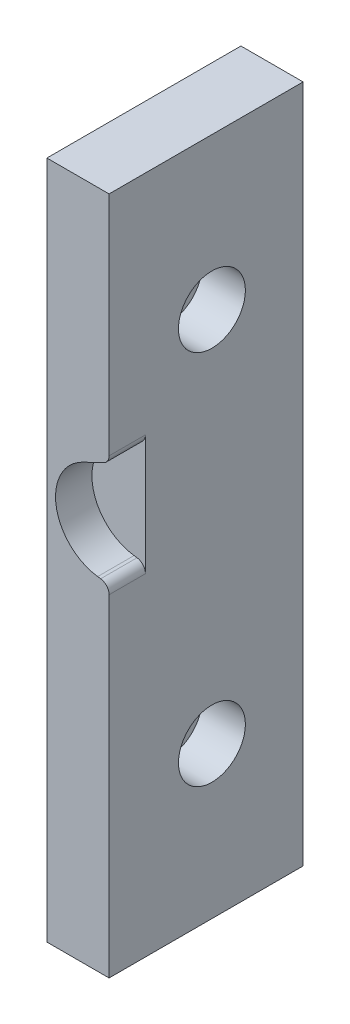
ISO-10303-21;
HEADER;
FILE_DESCRIPTION(('STEP AP214'),'2;1');
FILE_NAME('part.step','',(''),(''),'','','');
FILE_SCHEMA(('AUTOMOTIVE_DESIGN { 1 0 10303 214 1 1 1 1 }'));
ENDSEC;
DATA;
#1=APPLICATION_CONTEXT('core data for automotive mechanical design processes');
#2=APPLICATION_PROTOCOL_DEFINITION('international standard','automotive_design',2000,#1);
#3=PRODUCT_CONTEXT('',#1,'mechanical');
#4=PRODUCT('Part','Part','',(#3));
#5=PRODUCT_RELATED_PRODUCT_CATEGORY('part','',(#4));
#6=PRODUCT_DEFINITION_FORMATION('','',#4);
#7=PRODUCT_DEFINITION_CONTEXT('part definition',#1,'design');
#8=PRODUCT_DEFINITION('design','',#6,#7);
#9=PRODUCT_DEFINITION_SHAPE('','',#8);
#10=(LENGTH_UNIT() NAMED_UNIT(*) SI_UNIT(.MILLI.,.METRE.));
#11=(NAMED_UNIT(*) PLANE_ANGLE_UNIT() SI_UNIT($,.RADIAN.));
#12=(NAMED_UNIT(*) SI_UNIT($,.STERADIAN.) SOLID_ANGLE_UNIT());
#13=UNCERTAINTY_MEASURE_WITH_UNIT(LENGTH_MEASURE(1.E-05),#10,'distance_accuracy_value','');
#14=(GEOMETRIC_REPRESENTATION_CONTEXT(3) GLOBAL_UNCERTAINTY_ASSIGNED_CONTEXT((#13)) GLOBAL_UNIT_ASSIGNED_CONTEXT((#10,
#11,#12)) REPRESENTATION_CONTEXT('',''));
#15=CARTESIAN_POINT('',(0.,0.,0.));
#16=DIRECTION('',(0.,0.,1.));
#17=DIRECTION('',(1.,0.,0.));
#18=AXIS2_PLACEMENT_3D('',#15,#16,#17);
#19=CARTESIAN_POINT('',(-8.1407,-49.211738,-1.524));
#20=DIRECTION('',(1.,0.,0.));
#21=DIRECTION('',(0.,0.,-1.));
#22=AXIS2_PLACEMENT_3D('',#19,#20,#21);
#23=CYLINDRICAL_SURFACE('',#22,6.75767);
#24=CARTESIAN_POINT('',(-8.1407,-49.211738,-1.524));
#25=DIRECTION('',(1.,0.,0.));
#26=DIRECTION('',(0.,0.,-1.));
#27=AXIS2_PLACEMENT_3D('',#24,#25,#26);
#28=CIRCLE('',#27,6.75767);
#29=CARTESIAN_POINT('',(-8.1407,-49.211738,-8.28167));
#30=VERTEX_POINT('',#29);
#31=EDGE_CURVE('E227',#30,#30,#28,.T.);
#32=ORIENTED_EDGE('',*,*,#31,.F.);
#33=EDGE_LOOP('',(#32));
#34=FACE_BOUND('',#33,.T.);
#35=CARTESIAN_POINT('',(-3.1877,-49.211738,-1.524));
#36=DIRECTION('',(1.,0.,0.));
#37=DIRECTION('',(0.,0.,-1.));
#38=AXIS2_PLACEMENT_3D('',#35,#36,#37);
#39=CIRCLE('',#38,6.75767);
#40=CARTESIAN_POINT('',(-3.1877,-49.211738,-8.28167));
#41=VERTEX_POINT('',#40);
#42=EDGE_CURVE('E265',#41,#41,#39,.F.);
#43=ORIENTED_EDGE('',*,*,#42,.F.);
#44=EDGE_LOOP('',(#43));
#45=FACE_BOUND('',#44,.T.);
#46=ADVANCED_FACE('F45',(#34,#45),#23,.F.);
#47=CARTESIAN_POINT('',(-8.1407,49.211738,-1.524));
#48=DIRECTION('',(1.,0.,0.));
#49=DIRECTION('',(0.,0.,-1.));
#50=AXIS2_PLACEMENT_3D('',#47,#48,#49);
#51=CYLINDRICAL_SURFACE('',#50,6.75767);
#52=CARTESIAN_POINT('',(-8.1407,49.211738,-1.524));
#53=DIRECTION('',(1.,0.,0.));
#54=DIRECTION('',(0.,0.,-1.));
#55=AXIS2_PLACEMENT_3D('',#52,#53,#54);
#56=CIRCLE('',#55,6.75767);
#57=CARTESIAN_POINT('',(-8.1407,49.211738,-8.28167));
#58=VERTEX_POINT('',#57);
#59=EDGE_CURVE('E240',#58,#58,#56,.T.);
#60=ORIENTED_EDGE('',*,*,#59,.F.);
#61=EDGE_LOOP('',(#60));
#62=FACE_BOUND('',#61,.T.);
#63=CARTESIAN_POINT('',(-3.1877,49.211738,-1.524));
#64=DIRECTION('',(1.,0.,0.));
#65=DIRECTION('',(0.,0.,-1.));
#66=AXIS2_PLACEMENT_3D('',#63,#64,#65);
#67=CIRCLE('',#66,6.75767);
#68=CARTESIAN_POINT('',(-3.1877,49.211738,-8.28167));
#69=VERTEX_POINT('',#68);
#70=EDGE_CURVE('E262',#69,#69,#67,.F.);
#71=ORIENTED_EDGE('',*,*,#70,.F.);
#72=EDGE_LOOP('',(#71));
#73=FACE_BOUND('',#72,.T.);
#74=ADVANCED_FACE('F336',(#62,#73),#51,.F.);
#75=CARTESIAN_POINT('',(8.1407,88.9,25.4));
#76=DIRECTION('',(-1.,0.,0.));
#77=DIRECTION('',(0.,0.,1.));
#78=AXIS2_PLACEMENT_3D('',#75,#76,#77);
#79=PLANE('',#78);
#80=DIRECTION('',(0.,1.,0.));
#81=VECTOR('',#80,1.);
#82=CARTESIAN_POINT('',(8.1407,27.901182182498,15.875));
#83=LINE('',#82,#81);
#84=CARTESIAN_POINT('',(8.1407,-1.98819563841487,15.875));
#85=VERTEX_POINT('',#84);
#86=CARTESIAN_POINT('',(8.1407,29.5088515839507,15.875));
#87=VERTEX_POINT('',#86);
#88=EDGE_CURVE('E140',#85,#87,#83,.T.);
#89=ORIENTED_EDGE('',*,*,#88,.F.);
#90=DIRECTION('',(0.,0.,1.));
#91=VECTOR('',#90,1.);
#92=CARTESIAN_POINT('',(8.1407,-1.98819563841487,25.4));
#93=LINE('',#92,#91);
#94=CARTESIAN_POINT('',(8.1407,-1.98819563841487,25.4));
#95=VERTEX_POINT('',#94);
#96=EDGE_CURVE('E181',#85,#95,#93,.T.);
#97=ORIENTED_EDGE('',*,*,#96,.T.);
#98=DIRECTION('',(0.,1.,0.));
#99=VECTOR('',#98,1.);
#100=CARTESIAN_POINT('',(8.1407,88.9,25.4));
#101=LINE('',#100,#99);
#102=CARTESIAN_POINT('',(8.1407,-88.9,25.4));
#103=VERTEX_POINT('',#102);
#104=EDGE_CURVE('E211',#103,#95,#101,.T.);
#105=ORIENTED_EDGE('',*,*,#104,.F.);
#106=DIRECTION('',(0.,0.,-1.));
#107=VECTOR('',#106,1.);
#108=CARTESIAN_POINT('',(8.1407,-88.9,25.4));
#109=LINE('',#108,#107);
#110=CARTESIAN_POINT('',(8.1407,-88.9,-25.4));
#111=VERTEX_POINT('',#110);
#112=EDGE_CURVE('E234',#103,#111,#109,.T.);
#113=ORIENTED_EDGE('',*,*,#112,.T.);
#114=DIRECTION('',(0.,1.,0.));
#115=VECTOR('',#114,1.);
#116=CARTESIAN_POINT('',(8.1407,88.9,-25.4));
#117=LINE('',#116,#115);
#118=CARTESIAN_POINT('',(8.1407,88.9,-25.4));
#119=VERTEX_POINT('',#118);
#120=EDGE_CURVE('E235',#111,#119,#117,.T.);
#121=ORIENTED_EDGE('',*,*,#120,.T.);
#122=DIRECTION('',(0.,0.,-1.));
#123=VECTOR('',#122,1.);
#124=CARTESIAN_POINT('',(8.1407,88.9,25.4));
#125=LINE('',#124,#123);
#126=CARTESIAN_POINT('',(8.1407,88.9,25.4));
#127=VERTEX_POINT('',#126);
#128=EDGE_CURVE('E258',#127,#119,#125,.T.);
#129=ORIENTED_EDGE('',*,*,#128,.F.);
#130=CARTESIAN_POINT('',(8.1407,29.5088515839507,25.4));
#131=VERTEX_POINT('',#130);
#132=EDGE_CURVE('E219',#131,#127,#101,.T.);
#133=ORIENTED_EDGE('',*,*,#132,.F.);
#134=DIRECTION('',(0.,0.,1.));
#135=VECTOR('',#134,1.);
#136=CARTESIAN_POINT('',(8.1407,29.5088515839507,25.4));
#137=LINE('',#136,#135);
#138=EDGE_CURVE('E188',#131,#87,#137,.F.);
#139=ORIENTED_EDGE('',*,*,#138,.T.);
#140=EDGE_LOOP('',(#89,#97,#105,#113,#121,#129,#133,#139));
#141=FACE_BOUND('',#140,.T.);
#142=CARTESIAN_POINT('',(8.1407,49.211738,-1.524));
#143=DIRECTION('',(1.,0.,0.));
#144=DIRECTION('',(0.,0.,-1.));
#145=AXIS2_PLACEMENT_3D('',#142,#143,#144);
#146=CIRCLE('',#145,8.7641176);
#147=CARTESIAN_POINT('',(8.1407,49.211738,-10.2881176));
#148=VERTEX_POINT('',#147);
#149=EDGE_CURVE('E284',#148,#148,#146,.T.);
#150=ORIENTED_EDGE('',*,*,#149,.F.);
#151=EDGE_LOOP('',(#150));
#152=FACE_BOUND('',#151,.T.);
#153=CARTESIAN_POINT('',(8.1407,-49.211738,-1.524));
#154=DIRECTION('',(1.,0.,0.));
#155=DIRECTION('',(0.,0.,-1.));
#156=AXIS2_PLACEMENT_3D('',#153,#154,#155);
#157=CIRCLE('',#156,8.7641176);
#158=CARTESIAN_POINT('',(8.1407,-49.211738,-10.2881176));
#159=VERTEX_POINT('',#158);
#160=EDGE_CURVE('E285',#159,#159,#157,.T.);
#161=ORIENTED_EDGE('',*,*,#160,.F.);
#162=EDGE_LOOP('',(#161));
#163=FACE_BOUND('',#162,.T.);
#164=ADVANCED_FACE('F208',(#141,#152,#163),#79,.F.);
#165=CARTESIAN_POINT('',(8.1407,88.9,25.4));
#166=DIRECTION('',(0.,-1.,0.));
#167=DIRECTION('',(1.,0.,0.));
#168=AXIS2_PLACEMENT_3D('',#165,#166,#167);
#169=PLANE('',#168);
#170=DIRECTION('',(-1.,0.,0.));
#171=VECTOR('',#170,1.);
#172=CARTESIAN_POINT('',(8.1407,88.9,-25.4));
#173=LINE('',#172,#171);
#174=CARTESIAN_POINT('',(-8.1407,88.9,-25.4));
#175=VERTEX_POINT('',#174);
#176=EDGE_CURVE('E239',#119,#175,#173,.T.);
#177=ORIENTED_EDGE('',*,*,#176,.T.);
#178=DIRECTION('',(0.,0.,-1.));
#179=VECTOR('',#178,1.);
#180=CARTESIAN_POINT('',(-8.1407,88.9,25.4));
#181=LINE('',#180,#179);
#182=CARTESIAN_POINT('',(-8.1407,88.9,25.4));
#183=VERTEX_POINT('',#182);
#184=EDGE_CURVE('E254',#183,#175,#181,.T.);
#185=ORIENTED_EDGE('',*,*,#184,.F.);
#186=DIRECTION('',(-1.,0.,0.));
#187=VECTOR('',#186,1.);
#188=CARTESIAN_POINT('',(8.1407,88.9,25.4));
#189=LINE('',#188,#187);
#190=EDGE_CURVE('E218',#127,#183,#189,.T.);
#191=ORIENTED_EDGE('',*,*,#190,.F.);
#192=ORIENTED_EDGE('',*,*,#128,.T.);
#193=EDGE_LOOP('',(#177,#185,#191,#192));
#194=FACE_BOUND('',#193,.T.);
#195=ADVANCED_FACE('F311',(#194),#169,.F.);
#196=CARTESIAN_POINT('',(-8.1407,88.9,25.4));
#197=DIRECTION('',(1.,0.,0.));
#198=DIRECTION('',(0.,0.,-1.));
#199=AXIS2_PLACEMENT_3D('',#196,#197,#198);
#200=PLANE('',#199);
#201=ORIENTED_EDGE('',*,*,#59,.T.);
#202=EDGE_LOOP('',(#201));
#203=FACE_BOUND('',#202,.T.);
#204=ORIENTED_EDGE('',*,*,#31,.T.);
#205=EDGE_LOOP('',(#204));
#206=FACE_BOUND('',#205,.T.);
#207=DIRECTION('',(0.,-1.,0.));
#208=VECTOR('',#207,1.);
#209=CARTESIAN_POINT('',(-8.1407,88.9,-25.4));
#210=LINE('',#209,#208);
#211=CARTESIAN_POINT('',(-8.1407,-88.9,-25.4));
#212=VERTEX_POINT('',#211);
#213=EDGE_CURVE('E243',#175,#212,#210,.T.);
#214=ORIENTED_EDGE('',*,*,#213,.T.);
#215=DIRECTION('',(0.,0.,-1.));
#216=VECTOR('',#215,1.);
#217=CARTESIAN_POINT('',(-8.1407,-88.9,25.4));
#218=LINE('',#217,#216);
#219=CARTESIAN_POINT('',(-8.1407,-88.9,25.4));
#220=VERTEX_POINT('',#219);
#221=EDGE_CURVE('E250',#220,#212,#218,.T.);
#222=ORIENTED_EDGE('',*,*,#221,.F.);
#223=DIRECTION('',(0.,-1.,0.));
#224=VECTOR('',#223,1.);
#225=CARTESIAN_POINT('',(-8.1407,88.9,25.4));
#226=LINE('',#225,#224);
#227=EDGE_CURVE('E223',#183,#220,#226,.T.);
#228=ORIENTED_EDGE('',*,*,#227,.F.);
#229=ORIENTED_EDGE('',*,*,#184,.T.);
#230=EDGE_LOOP('',(#214,#222,#228,#229));
#231=FACE_BOUND('',#230,.T.);
#232=ADVANCED_FACE('F316',(#203,#206,#231),#200,.F.);
#233=CARTESIAN_POINT('',(-8.1407,-88.9,25.4));
#234=DIRECTION('',(0.,1.,0.));
#235=DIRECTION('',(-1.,0.,0.));
#236=AXIS2_PLACEMENT_3D('',#233,#234,#235);
#237=PLANE('',#236);
#238=DIRECTION('',(1.,0.,0.));
#239=VECTOR('',#238,1.);
#240=CARTESIAN_POINT('',(-8.1407,-88.9,-25.4));
#241=LINE('',#240,#239);
#242=EDGE_CURVE('E225',#212,#111,#241,.T.);
#243=ORIENTED_EDGE('',*,*,#242,.T.);
#244=ORIENTED_EDGE('',*,*,#112,.F.);
#245=DIRECTION('',(1.,0.,0.));
#246=VECTOR('',#245,1.);
#247=CARTESIAN_POINT('',(-8.1407,-88.9,25.4));
#248=LINE('',#247,#246);
#249=EDGE_CURVE('E215',#220,#103,#248,.T.);
#250=ORIENTED_EDGE('',*,*,#249,.F.);
#251=ORIENTED_EDGE('',*,*,#221,.T.);
#252=EDGE_LOOP('',(#243,#244,#250,#251));
#253=FACE_BOUND('',#252,.T.);
#254=ADVANCED_FACE('F319',(#253),#237,.F.);
#255=CARTESIAN_POINT('',(0.,0.,25.4));
#256=DIRECTION('',(0.,0.,1.));
#257=DIRECTION('',(1.,0.,0.));
#258=AXIS2_PLACEMENT_3D('',#255,#256,#257);
#259=PLANE('',#258);
#260=ORIENTED_EDGE('',*,*,#104,.T.);
#261=CARTESIAN_POINT('',(5.6007,-1.98819563841487,25.4));
#262=DIRECTION('',(0.,0.,1.));
#263=DIRECTION('',(1.,0.,0.));
#264=AXIS2_PLACEMENT_3D('',#261,#262,#263);
#265=CIRCLE('',#264,2.54);
#266=CARTESIAN_POINT('',(5.93498114050861,0.52971145262327,25.4));
#267=VERTEX_POINT('',#266);
#268=EDGE_CURVE('E192',#95,#267,#265,.T.);
#269=ORIENTED_EDGE('',*,*,#268,.T.);
#270=DIRECTION('',(0.991302004345733,-0.131606748231737,0.));
#271=VECTOR('',#270,1.);
#272=CARTESIAN_POINT('',(5.14779874837508,0.63421897347949,25.4));
#273=LINE('',#272,#271);
#274=CARTESIAN_POINT('',(5.14779874837508,0.63421897347949,25.4));
#275=VERTEX_POINT('',#274);
#276=EDGE_CURVE('E148',#275,#267,#273,.T.);
#277=ORIENTED_EDGE('',*,*,#276,.F.);
#278=CARTESIAN_POINT('',(6.81920445095724,13.2237544286771,25.4));
#279=DIRECTION('',(0.,0.,1.));
#280=DIRECTION('',(1.,0.,0.));
#281=AXIS2_PLACEMENT_3D('',#278,#279,#280);
#282=CIRCLE('',#281,12.7000000000117);
#283=CARTESIAN_POINT('',(1.38429999999978,24.7020737137143,25.4));
#284=VERTEX_POINT('',#283);
#285=EDGE_CURVE('E129',#284,#275,#282,.T.);
#286=ORIENTED_EDGE('',*,*,#285,.F.);
#287=DIRECTION('',(-0.903804668113621,-0.427945232355761,0.));
#288=VECTOR('',#287,1.);
#289=CARTESIAN_POINT('',(1.38429999999978,24.7020737137143,25.4));
#290=LINE('',#289,#288);
#291=CARTESIAN_POINT('',(6.68768089018363,27.2131877269421,25.4));
#292=VERTEX_POINT('',#291);
#293=EDGE_CURVE('E145',#292,#284,#290,.T.);
#294=ORIENTED_EDGE('',*,*,#293,.F.);
#295=CARTESIAN_POINT('',(5.6007,29.5088515839507,25.4));
#296=DIRECTION('',(0.,0.,1.));
#297=DIRECTION('',(1.,0.,0.));
#298=AXIS2_PLACEMENT_3D('',#295,#296,#297);
#299=CIRCLE('',#298,2.54);
#300=EDGE_CURVE('E187',#292,#131,#299,.T.);
#301=ORIENTED_EDGE('',*,*,#300,.T.);
#302=ORIENTED_EDGE('',*,*,#132,.T.);
#303=ORIENTED_EDGE('',*,*,#190,.T.);
#304=ORIENTED_EDGE('',*,*,#227,.T.);
#305=ORIENTED_EDGE('',*,*,#249,.T.);
#306=EDGE_LOOP('',(#260,#269,#277,#286,#294,#301,#302,#303,#304,#305));
#307=FACE_BOUND('',#306,.T.);
#308=ADVANCED_FACE('F213',(#307),#259,.T.);
#309=CARTESIAN_POINT('',(0.,0.,-25.4));
#310=DIRECTION('',(0.,0.,1.));
#311=DIRECTION('',(1.,0.,0.));
#312=AXIS2_PLACEMENT_3D('',#309,#310,#311);
#313=PLANE('',#312);
#314=ORIENTED_EDGE('',*,*,#120,.F.);
#315=ORIENTED_EDGE('',*,*,#242,.F.);
#316=ORIENTED_EDGE('',*,*,#213,.F.);
#317=ORIENTED_EDGE('',*,*,#176,.F.);
#318=EDGE_LOOP('',(#314,#315,#316,#317));
#319=FACE_BOUND('',#318,.T.);
#320=ADVANCED_FACE('F322',(#319),#313,.F.);
#321=CARTESIAN_POINT('',(-3.1877,88.9,25.4));
#322=DIRECTION('',(1.,0.,0.));
#323=DIRECTION('',(0.,0.,-1.));
#324=AXIS2_PLACEMENT_3D('',#321,#322,#323);
#325=PLANE('',#324);
#326=CARTESIAN_POINT('',(-3.1877,49.211738,-1.524));
#327=DIRECTION('',(1.,0.,0.));
#328=DIRECTION('',(0.,0.,-1.));
#329=AXIS2_PLACEMENT_3D('',#326,#327,#328);
#330=CIRCLE('',#329,8.7641176);
#331=CARTESIAN_POINT('',(-3.1877,49.211738,-10.2881176));
#332=VERTEX_POINT('',#331);
#333=EDGE_CURVE('E266',#332,#332,#330,.F.);
#334=ORIENTED_EDGE('',*,*,#333,.F.);
#335=EDGE_LOOP('',(#334));
#336=FACE_BOUND('',#335,.T.);
#337=ORIENTED_EDGE('',*,*,#70,.T.);
#338=EDGE_LOOP('',(#337));
#339=FACE_BOUND('',#338,.T.);
#340=ADVANCED_FACE('F324',(#336,#339),#325,.T.);
#341=CARTESIAN_POINT('',(-32.9293679443055,49.211738,-1.524));
#342=DIRECTION('',(1.,0.,0.));
#343=DIRECTION('',(0.,0.,-1.));
#344=AXIS2_PLACEMENT_3D('',#341,#342,#343);
#345=CYLINDRICAL_SURFACE('',#344,8.7641176);
#346=ORIENTED_EDGE('',*,*,#333,.T.);
#347=EDGE_LOOP('',(#346));
#348=FACE_BOUND('',#347,.T.);
#349=ORIENTED_EDGE('',*,*,#149,.T.);
#350=EDGE_LOOP('',(#349));
#351=FACE_BOUND('',#350,.T.);
#352=ADVANCED_FACE('F330',(#348,#351),#345,.F.);
#353=CARTESIAN_POINT('',(-3.1877,88.9,25.4));
#354=DIRECTION('',(1.,0.,0.));
#355=DIRECTION('',(0.,0.,-1.));
#356=AXIS2_PLACEMENT_3D('',#353,#354,#355);
#357=PLANE('',#356);
#358=CARTESIAN_POINT('',(-3.1877,-49.211738,-1.524));
#359=DIRECTION('',(1.,0.,0.));
#360=DIRECTION('',(0.,0.,-1.));
#361=AXIS2_PLACEMENT_3D('',#358,#359,#360);
#362=CIRCLE('',#361,8.7641176);
#363=CARTESIAN_POINT('',(-3.1877,-49.211738,-10.2881176));
#364=VERTEX_POINT('',#363);
#365=EDGE_CURVE('E280',#364,#364,#362,.F.);
#366=ORIENTED_EDGE('',*,*,#365,.F.);
#367=EDGE_LOOP('',(#366));
#368=FACE_BOUND('',#367,.T.);
#369=ORIENTED_EDGE('',*,*,#42,.T.);
#370=EDGE_LOOP('',(#369));
#371=FACE_BOUND('',#370,.T.);
#372=ADVANCED_FACE('F349',(#368,#371),#357,.T.);
#373=CARTESIAN_POINT('',(-32.9293679443055,-49.211738,-1.524));
#374=DIRECTION('',(1.,0.,0.));
#375=DIRECTION('',(0.,0.,-1.));
#376=AXIS2_PLACEMENT_3D('',#373,#374,#375);
#377=CYLINDRICAL_SURFACE('',#376,8.7641176);
#378=ORIENTED_EDGE('',*,*,#365,.T.);
#379=EDGE_LOOP('',(#378));
#380=FACE_BOUND('',#379,.T.);
#381=ORIENTED_EDGE('',*,*,#160,.T.);
#382=EDGE_LOOP('',(#381));
#383=FACE_BOUND('',#382,.T.);
#384=ADVANCED_FACE('F346',(#380,#383),#377,.F.);
#385=CARTESIAN_POINT('',(6.81920445095724,13.2237544286771,15.875));
#386=DIRECTION('',(0.,0.,1.));
#387=DIRECTION('',(1.,0.,0.));
#388=AXIS2_PLACEMENT_3D('',#385,#386,#387);
#389=CYLINDRICAL_SURFACE('',#388,12.7000000000117);
#390=ORIENTED_EDGE('',*,*,#285,.T.);
#391=DIRECTION('',(0.,0.,1.));
#392=VECTOR('',#391,1.);
#393=CARTESIAN_POINT('',(5.14779874837508,0.63421897347949,15.875));
#394=LINE('',#393,#392);
#395=CARTESIAN_POINT('',(5.14779874837508,0.63421897347949,15.875));
#396=VERTEX_POINT('',#395);
#397=EDGE_CURVE('E123',#396,#275,#394,.T.);
#398=ORIENTED_EDGE('',*,*,#397,.F.);
#399=CARTESIAN_POINT('',(6.81920445095724,13.2237544286771,15.875));
#400=DIRECTION('',(0.,0.,1.));
#401=DIRECTION('',(1.,0.,0.));
#402=AXIS2_PLACEMENT_3D('',#399,#400,#401);
#403=CIRCLE('',#402,12.7000000000117);
#404=CARTESIAN_POINT('',(1.38429999999978,24.7020737137143,15.875));
#405=VERTEX_POINT('',#404);
#406=EDGE_CURVE('E127',#405,#396,#403,.T.);
#407=ORIENTED_EDGE('',*,*,#406,.F.);
#408=DIRECTION('',(0.,0.,1.));
#409=VECTOR('',#408,1.);
#410=CARTESIAN_POINT('',(1.38429999999978,24.7020737137143,15.875));
#411=LINE('',#410,#409);
#412=EDGE_CURVE('E132',#405,#284,#411,.T.);
#413=ORIENTED_EDGE('',*,*,#412,.T.);
#414=EDGE_LOOP('',(#390,#398,#407,#413));
#415=FACE_BOUND('',#414,.T.);
#416=ADVANCED_FACE('F124',(#415),#389,.F.);
#417=CARTESIAN_POINT('',(1.38429999999978,24.7020737137143,15.875));
#418=DIRECTION('',(-0.427945232355762,0.903804668113621,0.));
#419=DIRECTION('',(-0.903804668113621,-0.427945232355762,0.));
#420=AXIS2_PLACEMENT_3D('',#417,#418,#419);
#421=PLANE('',#420);
#422=DIRECTION('',(-0.903804668113621,-0.427945232355761,0.));
#423=VECTOR('',#422,1.);
#424=CARTESIAN_POINT('',(1.38429999999978,24.7020737137143,15.875));
#425=LINE('',#424,#423);
#426=CARTESIAN_POINT('',(6.68768089018363,27.2131877269421,15.875));
#427=VERTEX_POINT('',#426);
#428=EDGE_CURVE('E133',#427,#405,#425,.T.);
#429=ORIENTED_EDGE('',*,*,#428,.F.);
#430=DIRECTION('',(0.,0.,1.));
#431=VECTOR('',#430,1.);
#432=CARTESIAN_POINT('',(6.68768089018363,27.2131877269421,15.875));
#433=LINE('',#432,#431);
#434=EDGE_CURVE('E196',#427,#292,#433,.T.);
#435=ORIENTED_EDGE('',*,*,#434,.T.);
#436=ORIENTED_EDGE('',*,*,#293,.T.);
#437=ORIENTED_EDGE('',*,*,#412,.F.);
#438=EDGE_LOOP('',(#429,#435,#436,#437));
#439=FACE_BOUND('',#438,.T.);
#440=ADVANCED_FACE('F302',(#439),#421,.F.);
#441=CARTESIAN_POINT('',(5.14779874837508,0.63421897347949,15.875));
#442=DIRECTION('',(-0.131606748231737,-0.991302004345733,0.));
#443=DIRECTION('',(0.991302004345733,-0.131606748231737,0.));
#444=AXIS2_PLACEMENT_3D('',#441,#442,#443);
#445=PLANE('',#444);
#446=ORIENTED_EDGE('',*,*,#276,.T.);
#447=DIRECTION('',(0.,0.,1.));
#448=VECTOR('',#447,1.);
#449=CARTESIAN_POINT('',(5.93498114050861,0.52971145262327,15.875));
#450=LINE('',#449,#448);
#451=CARTESIAN_POINT('',(5.93498114050861,0.52971145262327,15.875));
#452=VERTEX_POINT('',#451);
#453=EDGE_CURVE('E67',#267,#452,#450,.F.);
#454=ORIENTED_EDGE('',*,*,#453,.T.);
#455=DIRECTION('',(0.991302004345733,-0.131606748231737,0.));
#456=VECTOR('',#455,1.);
#457=CARTESIAN_POINT('',(5.14779874837508,0.63421897347949,15.875));
#458=LINE('',#457,#456);
#459=EDGE_CURVE('E135',#396,#452,#458,.T.);
#460=ORIENTED_EDGE('',*,*,#459,.F.);
#461=ORIENTED_EDGE('',*,*,#397,.T.);
#462=EDGE_LOOP('',(#446,#454,#460,#461));
#463=FACE_BOUND('',#462,.T.);
#464=ADVANCED_FACE('F136',(#463),#445,.F.);
#465=CARTESIAN_POINT('',(6.81920445095724,13.2237544286771,15.875));
#466=DIRECTION('',(0.,0.,1.));
#467=DIRECTION('',(1.,0.,0.));
#468=AXIS2_PLACEMENT_3D('',#465,#466,#467);
#469=PLANE('',#468);
#470=ORIENTED_EDGE('',*,*,#406,.T.);
#471=ORIENTED_EDGE('',*,*,#459,.T.);
#472=CARTESIAN_POINT('',(5.6007,-1.98819563841487,15.875));
#473=DIRECTION('',(0.,0.,1.));
#474=DIRECTION('',(1.,0.,0.));
#475=AXIS2_PLACEMENT_3D('',#472,#473,#474);
#476=CIRCLE('',#475,2.54);
#477=EDGE_CURVE('E54',#452,#85,#476,.F.);
#478=ORIENTED_EDGE('',*,*,#477,.T.);
#479=ORIENTED_EDGE('',*,*,#88,.T.);
#480=CARTESIAN_POINT('',(5.6007,29.5088515839507,15.875));
#481=DIRECTION('',(0.,0.,1.));
#482=DIRECTION('',(1.,0.,0.));
#483=AXIS2_PLACEMENT_3D('',#480,#481,#482);
#484=CIRCLE('',#483,2.54);
#485=EDGE_CURVE('E13',#87,#427,#484,.F.);
#486=ORIENTED_EDGE('',*,*,#485,.T.);
#487=ORIENTED_EDGE('',*,*,#428,.T.);
#488=EDGE_LOOP('',(#470,#471,#478,#479,#486,#487));
#489=FACE_BOUND('',#488,.T.);
#490=ADVANCED_FACE('F142',(#489),#469,.T.);
#491=CARTESIAN_POINT('',(5.6007,-1.98819563841487,25.4));
#492=DIRECTION('',(0.,0.,1.));
#493=DIRECTION('',(1.,0.,0.));
#494=AXIS2_PLACEMENT_3D('',#491,#492,#493);
#495=CYLINDRICAL_SURFACE('',#494,2.54);
#496=ORIENTED_EDGE('',*,*,#477,.F.);
#497=ORIENTED_EDGE('',*,*,#453,.F.);
#498=ORIENTED_EDGE('',*,*,#268,.F.);
#499=ORIENTED_EDGE('',*,*,#96,.F.);
#500=EDGE_LOOP('',(#496,#497,#498,#499));
#501=FACE_BOUND('',#500,.T.);
#502=ADVANCED_FACE('F204',(#501),#495,.T.);
#503=CARTESIAN_POINT('',(5.6007,29.5088515839507,15.875));
#504=DIRECTION('',(0.,0.,1.));
#505=DIRECTION('',(1.,0.,0.));
#506=AXIS2_PLACEMENT_3D('',#503,#504,#505);
#507=CYLINDRICAL_SURFACE('',#506,2.54);
#508=ORIENTED_EDGE('',*,*,#485,.F.);
#509=ORIENTED_EDGE('',*,*,#138,.F.);
#510=ORIENTED_EDGE('',*,*,#300,.F.);
#511=ORIENTED_EDGE('',*,*,#434,.F.);
#512=EDGE_LOOP('',(#508,#509,#510,#511));
#513=FACE_BOUND('',#512,.T.);
#514=ADVANCED_FACE('F47',(#513),#507,.T.);
#515=CLOSED_SHELL('',(#46,#74,#164,#195,#232,#254,#308,#320,#340,#352,#372,#384,#416,#440,#464,
#490,#502,#514));
#516=MANIFOLD_SOLID_BREP('B2',#515);
#517=ADVANCED_BREP_SHAPE_REPRESENTATION('',(#18,#516),#14);
#518=SHAPE_DEFINITION_REPRESENTATION(#9,#517);
ENDSEC;
END-ISO-10303-21;
